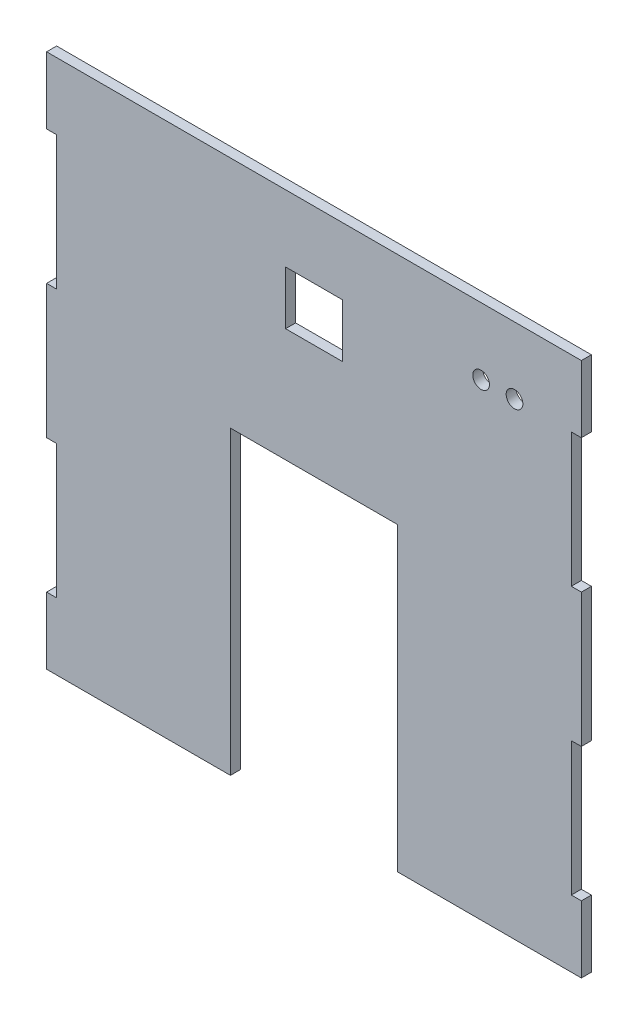
ISO-10303-21;
HEADER;
FILE_DESCRIPTION(('STEP AP214'),'2;1');
FILE_NAME('part.step','',(''),(''),'','','');
FILE_SCHEMA(('AUTOMOTIVE_DESIGN { 1 0 10303 214 1 1 1 1 }'));
ENDSEC;
DATA;
#1=APPLICATION_CONTEXT('core data for automotive mechanical design processes');
#2=APPLICATION_PROTOCOL_DEFINITION('international standard','automotive_design',2000,#1);
#3=PRODUCT_CONTEXT('',#1,'mechanical');
#4=PRODUCT('Part','Part','',(#3));
#5=PRODUCT_RELATED_PRODUCT_CATEGORY('part','',(#4));
#6=PRODUCT_DEFINITION_FORMATION('','',#4);
#7=PRODUCT_DEFINITION_CONTEXT('part definition',#1,'design');
#8=PRODUCT_DEFINITION('design','',#6,#7);
#9=PRODUCT_DEFINITION_SHAPE('','',#8);
#10=(LENGTH_UNIT() NAMED_UNIT(*) SI_UNIT(.MILLI.,.METRE.));
#11=(NAMED_UNIT(*) PLANE_ANGLE_UNIT() SI_UNIT($,.RADIAN.));
#12=(NAMED_UNIT(*) SI_UNIT($,.STERADIAN.) SOLID_ANGLE_UNIT());
#13=UNCERTAINTY_MEASURE_WITH_UNIT(LENGTH_MEASURE(1.E-05),#10,'distance_accuracy_value','');
#14=(GEOMETRIC_REPRESENTATION_CONTEXT(3) GLOBAL_UNCERTAINTY_ASSIGNED_CONTEXT((#13)) GLOBAL_UNIT_ASSIGNED_CONTEXT((#10,
#11,#12)) REPRESENTATION_CONTEXT('',''));
#15=CARTESIAN_POINT('',(0.,0.,0.));
#16=DIRECTION('',(0.,0.,1.));
#17=DIRECTION('',(1.,0.,0.));
#18=AXIS2_PLACEMENT_3D('',#15,#16,#17);
#19=CARTESIAN_POINT('',(79.9999999999999,0.,3.));
#20=DIRECTION('',(1.,0.,0.));
#21=DIRECTION('',(0.,1.,0.));
#22=AXIS2_PLACEMENT_3D('',#19,#20,#21);
#23=PLANE('',#22);
#24=DIRECTION('',(0.,0.,1.));
#25=VECTOR('',#24,1.);
#26=CARTESIAN_POINT('',(79.9999999999999,60.,0.));
#27=LINE('',#26,#25);
#28=CARTESIAN_POINT('',(79.9999999999999,60.,0.));
#29=VERTEX_POINT('',#28);
#30=CARTESIAN_POINT('',(79.9999999999999,60.,3.));
#31=VERTEX_POINT('',#30);
#32=EDGE_CURVE('E317',#29,#31,#27,.T.);
#33=ORIENTED_EDGE('',*,*,#32,.F.);
#34=DIRECTION('',(0.,-1.,0.));
#35=VECTOR('',#34,1.);
#36=CARTESIAN_POINT('',(79.9999999999999,0.,0.));
#37=LINE('',#36,#35);
#38=CARTESIAN_POINT('',(79.9999999999999,80.,0.));
#39=VERTEX_POINT('',#38);
#40=EDGE_CURVE('E449',#39,#29,#37,.T.);
#41=ORIENTED_EDGE('',*,*,#40,.F.);
#42=DIRECTION('',(0.,0.,-1.));
#43=VECTOR('',#42,1.);
#44=CARTESIAN_POINT('',(79.9999999999999,80.,3.));
#45=LINE('',#44,#43);
#46=CARTESIAN_POINT('',(79.9999999999999,80.,3.));
#47=VERTEX_POINT('',#46);
#48=EDGE_CURVE('E512',#47,#39,#45,.T.);
#49=ORIENTED_EDGE('',*,*,#48,.F.);
#50=DIRECTION('',(0.,-1.,0.));
#51=VECTOR('',#50,1.);
#52=CARTESIAN_POINT('',(79.9999999999999,0.,3.));
#53=LINE('',#52,#51);
#54=EDGE_CURVE('E394',#47,#31,#53,.T.);
#55=ORIENTED_EDGE('',*,*,#54,.T.);
#56=EDGE_LOOP('',(#33,#41,#49,#55));
#57=FACE_BOUND('',#56,.T.);
#58=ADVANCED_FACE('F41',(#57),#23,.T.);
#59=DIRECTION('',(0.,0.,1.));
#60=VECTOR('',#59,1.);
#61=CARTESIAN_POINT('',(79.9999999999999,20.,0.));
#62=LINE('',#61,#60);
#63=CARTESIAN_POINT('',(79.9999999999999,20.,0.));
#64=VERTEX_POINT('',#63);
#65=CARTESIAN_POINT('',(79.9999999999999,20.,3.));
#66=VERTEX_POINT('',#65);
#67=EDGE_CURVE('E67',#64,#66,#62,.T.);
#68=ORIENTED_EDGE('',*,*,#67,.T.);
#69=CARTESIAN_POINT('',(79.9999999999999,-20.,3.));
#70=VERTEX_POINT('',#69);
#71=EDGE_CURVE('E399',#66,#70,#53,.T.);
#72=ORIENTED_EDGE('',*,*,#71,.T.);
#73=DIRECTION('',(0.,0.,1.));
#74=VECTOR('',#73,1.);
#75=CARTESIAN_POINT('',(79.9999999999999,-20.,0.));
#76=LINE('',#75,#74);
#77=CARTESIAN_POINT('',(79.9999999999999,-20.,0.));
#78=VERTEX_POINT('',#77);
#79=EDGE_CURVE('E284',#78,#70,#76,.T.);
#80=ORIENTED_EDGE('',*,*,#79,.F.);
#81=EDGE_CURVE('E454',#64,#78,#37,.T.);
#82=ORIENTED_EDGE('',*,*,#81,.F.);
#83=EDGE_LOOP('',(#68,#72,#80,#82));
#84=FACE_BOUND('',#83,.T.);
#85=ADVANCED_FACE('F557',(#84),#23,.T.);
#86=CARTESIAN_POINT('',(-80.,0.,3.));
#87=DIRECTION('',(1.,0.,0.));
#88=DIRECTION('',(0.,1.,0.));
#89=AXIS2_PLACEMENT_3D('',#86,#87,#88);
#90=PLANE('',#89);
#91=DIRECTION('',(0.,-1.,0.));
#92=VECTOR('',#91,1.);
#93=CARTESIAN_POINT('',(-80.,0.,3.));
#94=LINE('',#93,#92);
#95=CARTESIAN_POINT('',(-80.,-60.,3.));
#96=VERTEX_POINT('',#95);
#97=CARTESIAN_POINT('',(-80.,-80.,3.));
#98=VERTEX_POINT('',#97);
#99=EDGE_CURVE('E403',#96,#98,#94,.T.);
#100=ORIENTED_EDGE('',*,*,#99,.F.);
#101=DIRECTION('',(0.,0.,1.));
#102=VECTOR('',#101,1.);
#103=CARTESIAN_POINT('',(-80.,-60.,0.));
#104=LINE('',#103,#102);
#105=CARTESIAN_POINT('',(-80.,-60.,0.));
#106=VERTEX_POINT('',#105);
#107=EDGE_CURVE('E242',#106,#96,#104,.T.);
#108=ORIENTED_EDGE('',*,*,#107,.F.);
#109=DIRECTION('',(0.,-1.,0.));
#110=VECTOR('',#109,1.);
#111=CARTESIAN_POINT('',(-80.,0.,0.));
#112=LINE('',#111,#110);
#113=CARTESIAN_POINT('',(-80.,-80.,0.));
#114=VERTEX_POINT('',#113);
#115=EDGE_CURVE('E458',#106,#114,#112,.T.);
#116=ORIENTED_EDGE('',*,*,#115,.T.);
#117=DIRECTION('',(0.,0.,-1.));
#118=VECTOR('',#117,1.);
#119=CARTESIAN_POINT('',(-80.,-80.,3.));
#120=LINE('',#119,#118);
#121=EDGE_CURVE('E505',#98,#114,#120,.T.);
#122=ORIENTED_EDGE('',*,*,#121,.F.);
#123=EDGE_LOOP('',(#100,#108,#116,#122));
#124=FACE_BOUND('',#123,.T.);
#125=ADVANCED_FACE('F577',(#124),#90,.F.);
#126=CARTESIAN_POINT('',(-80.,20.,0.));
#127=VERTEX_POINT('',#126);
#128=CARTESIAN_POINT('',(-80.,-20.,0.));
#129=VERTEX_POINT('',#128);
#130=EDGE_CURVE('E463',#127,#129,#112,.T.);
#131=ORIENTED_EDGE('',*,*,#130,.T.);
#132=DIRECTION('',(0.,0.,1.));
#133=VECTOR('',#132,1.);
#134=CARTESIAN_POINT('',(-80.,-20.,0.));
#135=LINE('',#134,#133);
#136=CARTESIAN_POINT('',(-80.,-20.,3.));
#137=VERTEX_POINT('',#136);
#138=EDGE_CURVE('E586',#129,#137,#135,.T.);
#139=ORIENTED_EDGE('',*,*,#138,.T.);
#140=CARTESIAN_POINT('',(-80.,20.,3.));
#141=VERTEX_POINT('',#140);
#142=EDGE_CURVE('E408',#141,#137,#94,.T.);
#143=ORIENTED_EDGE('',*,*,#142,.F.);
#144=DIRECTION('',(0.,0.,1.));
#145=VECTOR('',#144,1.);
#146=CARTESIAN_POINT('',(-80.,20.,0.));
#147=LINE('',#146,#145);
#148=EDGE_CURVE('E366',#127,#141,#147,.T.);
#149=ORIENTED_EDGE('',*,*,#148,.F.);
#150=EDGE_LOOP('',(#131,#139,#143,#149));
#151=FACE_BOUND('',#150,.T.);
#152=ADVANCED_FACE('F584',(#151),#90,.F.);
#153=CARTESIAN_POINT('',(0.,60.,3.));
#154=DIRECTION('',(0.,1.,0.));
#155=DIRECTION('',(0.,0.,1.));
#156=AXIS2_PLACEMENT_3D('',#153,#154,#155);
#157=PLANE('',#156);
#158=DIRECTION('',(1.,0.,0.));
#159=VECTOR('',#158,1.);
#160=CARTESIAN_POINT('',(0.,60.,0.));
#161=LINE('',#160,#159);
#162=CARTESIAN_POINT('',(-8.5,60.,0.));
#163=VERTEX_POINT('',#162);
#164=CARTESIAN_POINT('',(8.5,60.,0.));
#165=VERTEX_POINT('',#164);
#166=EDGE_CURVE('E472',#163,#165,#161,.T.);
#167=ORIENTED_EDGE('',*,*,#166,.T.);
#168=DIRECTION('',(0.,0.,-1.));
#169=VECTOR('',#168,1.);
#170=CARTESIAN_POINT('',(8.5,60.,3.));
#171=LINE('',#170,#169);
#172=CARTESIAN_POINT('',(8.5,60.,3.));
#173=VERTEX_POINT('',#172);
#174=EDGE_CURVE('E12',#173,#165,#171,.T.);
#175=ORIENTED_EDGE('',*,*,#174,.F.);
#176=DIRECTION('',(1.,0.,0.));
#177=VECTOR('',#176,1.);
#178=CARTESIAN_POINT('',(0.,60.,3.));
#179=LINE('',#178,#177);
#180=CARTESIAN_POINT('',(-8.5,60.,3.));
#181=VERTEX_POINT('',#180);
#182=EDGE_CURVE('E416',#181,#173,#179,.T.);
#183=ORIENTED_EDGE('',*,*,#182,.F.);
#184=DIRECTION('',(0.,0.,-1.));
#185=VECTOR('',#184,1.);
#186=CARTESIAN_POINT('',(-8.5,60.,3.));
#187=LINE('',#186,#185);
#188=EDGE_CURVE('E487',#181,#163,#187,.T.);
#189=ORIENTED_EDGE('',*,*,#188,.T.);
#190=EDGE_LOOP('',(#167,#175,#183,#189));
#191=FACE_BOUND('',#190,.T.);
#192=ADVANCED_FACE('F651',(#191),#157,.F.);
#193=CARTESIAN_POINT('',(8.50000000000001,0.,3.));
#194=DIRECTION('',(1.,0.,0.));
#195=DIRECTION('',(0.,1.,0.));
#196=AXIS2_PLACEMENT_3D('',#193,#194,#195);
#197=PLANE('',#196);
#198=DIRECTION('',(0.,-1.,0.));
#199=VECTOR('',#198,1.);
#200=CARTESIAN_POINT('',(8.50000000000001,0.,0.));
#201=LINE('',#200,#199);
#202=CARTESIAN_POINT('',(8.5,44.,0.));
#203=VERTEX_POINT('',#202);
#204=EDGE_CURVE('E476',#165,#203,#201,.T.);
#205=ORIENTED_EDGE('',*,*,#204,.T.);
#206=DIRECTION('',(0.,0.,-1.));
#207=VECTOR('',#206,1.);
#208=CARTESIAN_POINT('',(8.5,44.,3.));
#209=LINE('',#208,#207);
#210=CARTESIAN_POINT('',(8.5,44.,3.));
#211=VERTEX_POINT('',#210);
#212=EDGE_CURVE('E51',#211,#203,#209,.T.);
#213=ORIENTED_EDGE('',*,*,#212,.F.);
#214=DIRECTION('',(0.,-1.,0.));
#215=VECTOR('',#214,1.);
#216=CARTESIAN_POINT('',(8.50000000000001,0.,3.));
#217=LINE('',#216,#215);
#218=EDGE_CURVE('E420',#173,#211,#217,.T.);
#219=ORIENTED_EDGE('',*,*,#218,.F.);
#220=ORIENTED_EDGE('',*,*,#174,.T.);
#221=EDGE_LOOP('',(#205,#213,#219,#220));
#222=FACE_BOUND('',#221,.T.);
#223=ADVANCED_FACE('F655',(#222),#197,.F.);
#224=CARTESIAN_POINT('',(0.,44.,3.));
#225=DIRECTION('',(0.,1.,0.));
#226=DIRECTION('',(0.,0.,1.));
#227=AXIS2_PLACEMENT_3D('',#224,#225,#226);
#228=PLANE('',#227);
#229=DIRECTION('',(1.,0.,0.));
#230=VECTOR('',#229,1.);
#231=CARTESIAN_POINT('',(0.,44.,0.));
#232=LINE('',#231,#230);
#233=CARTESIAN_POINT('',(-8.49999999999999,44.,0.));
#234=VERTEX_POINT('',#233);
#235=EDGE_CURVE('E480',#234,#203,#232,.T.);
#236=ORIENTED_EDGE('',*,*,#235,.F.);
#237=DIRECTION('',(0.,0.,-1.));
#238=VECTOR('',#237,1.);
#239=CARTESIAN_POINT('',(-8.49999999999999,44.,3.));
#240=LINE('',#239,#238);
#241=CARTESIAN_POINT('',(-8.49999999999999,44.,3.));
#242=VERTEX_POINT('',#241);
#243=EDGE_CURVE('E490',#242,#234,#240,.T.);
#244=ORIENTED_EDGE('',*,*,#243,.F.);
#245=DIRECTION('',(1.,0.,0.));
#246=VECTOR('',#245,1.);
#247=CARTESIAN_POINT('',(0.,44.,3.));
#248=LINE('',#247,#246);
#249=EDGE_CURVE('E423',#242,#211,#248,.T.);
#250=ORIENTED_EDGE('',*,*,#249,.T.);
#251=ORIENTED_EDGE('',*,*,#212,.T.);
#252=EDGE_LOOP('',(#236,#244,#250,#251));
#253=FACE_BOUND('',#252,.T.);
#254=ADVANCED_FACE('F639',(#253),#228,.T.);
#255=CARTESIAN_POINT('',(25.,0.,3.));
#256=DIRECTION('',(-1.,0.,0.));
#257=DIRECTION('',(0.,-1.,0.));
#258=AXIS2_PLACEMENT_3D('',#255,#256,#257);
#259=PLANE('',#258);
#260=DIRECTION('',(0.,1.,0.));
#261=VECTOR('',#260,1.);
#262=CARTESIAN_POINT('',(25.,0.,0.));
#263=LINE('',#262,#261);
#264=CARTESIAN_POINT('',(25.,-80.,0.));
#265=VERTEX_POINT('',#264);
#266=CARTESIAN_POINT('',(25.,10.,0.));
#267=VERTEX_POINT('',#266);
#268=EDGE_CURVE('E439',#265,#267,#263,.T.);
#269=ORIENTED_EDGE('',*,*,#268,.F.);
#270=DIRECTION('',(0.,0.,-1.));
#271=VECTOR('',#270,1.);
#272=CARTESIAN_POINT('',(25.,-80.,3.));
#273=LINE('',#272,#271);
#274=CARTESIAN_POINT('',(25.,-80.,3.));
#275=VERTEX_POINT('',#274);
#276=EDGE_CURVE('E45',#275,#265,#273,.T.);
#277=ORIENTED_EDGE('',*,*,#276,.F.);
#278=DIRECTION('',(0.,1.,0.));
#279=VECTOR('',#278,1.);
#280=CARTESIAN_POINT('',(25.,0.,3.));
#281=LINE('',#280,#279);
#282=CARTESIAN_POINT('',(25.,10.,3.));
#283=VERTEX_POINT('',#282);
#284=EDGE_CURVE('E384',#275,#283,#281,.T.);
#285=ORIENTED_EDGE('',*,*,#284,.T.);
#286=DIRECTION('',(0.,0.,-1.));
#287=VECTOR('',#286,1.);
#288=CARTESIAN_POINT('',(25.,10.,3.));
#289=LINE('',#288,#287);
#290=EDGE_CURVE('E431',#283,#267,#289,.T.);
#291=ORIENTED_EDGE('',*,*,#290,.T.);
#292=EDGE_LOOP('',(#269,#277,#285,#291));
#293=FACE_BOUND('',#292,.T.);
#294=ADVANCED_FACE('F531',(#293),#259,.T.);
#295=CARTESIAN_POINT('',(0.,-80.,3.));
#296=DIRECTION('',(0.,1.,0.));
#297=DIRECTION('',(0.,0.,1.));
#298=AXIS2_PLACEMENT_3D('',#295,#296,#297);
#299=PLANE('',#298);
#300=DIRECTION('',(1.,0.,0.));
#301=VECTOR('',#300,1.);
#302=CARTESIAN_POINT('',(0.,-80.,0.));
#303=LINE('',#302,#301);
#304=CARTESIAN_POINT('',(80.,-80.,0.));
#305=VERTEX_POINT('',#304);
#306=EDGE_CURVE('E443',#265,#305,#303,.T.);
#307=ORIENTED_EDGE('',*,*,#306,.T.);
#308=DIRECTION('',(0.,0.,-1.));
#309=VECTOR('',#308,1.);
#310=CARTESIAN_POINT('',(80.,-80.,3.));
#311=LINE('',#310,#309);
#312=CARTESIAN_POINT('',(80.,-80.,3.));
#313=VERTEX_POINT('',#312);
#314=EDGE_CURVE('E514',#313,#305,#311,.T.);
#315=ORIENTED_EDGE('',*,*,#314,.F.);
#316=DIRECTION('',(1.,0.,0.));
#317=VECTOR('',#316,1.);
#318=CARTESIAN_POINT('',(0.,-80.,3.));
#319=LINE('',#318,#317);
#320=EDGE_CURVE('E388',#275,#313,#319,.T.);
#321=ORIENTED_EDGE('',*,*,#320,.F.);
#322=ORIENTED_EDGE('',*,*,#276,.T.);
#323=EDGE_LOOP('',(#307,#315,#321,#322));
#324=FACE_BOUND('',#323,.T.);
#325=ADVANCED_FACE('F524',(#324),#299,.F.);
#326=DIRECTION('',(0.,0.,1.));
#327=VECTOR('',#326,1.);
#328=CARTESIAN_POINT('',(80.,-60.,0.));
#329=LINE('',#328,#327);
#330=CARTESIAN_POINT('',(80.,-60.,0.));
#331=VERTEX_POINT('',#330);
#332=CARTESIAN_POINT('',(80.,-60.,3.));
#333=VERTEX_POINT('',#332);
#334=EDGE_CURVE('E59',#331,#333,#329,.T.);
#335=ORIENTED_EDGE('',*,*,#334,.T.);
#336=EDGE_CURVE('E392',#333,#313,#53,.T.);
#337=ORIENTED_EDGE('',*,*,#336,.T.);
#338=ORIENTED_EDGE('',*,*,#314,.T.);
#339=EDGE_CURVE('E447',#331,#305,#37,.T.);
#340=ORIENTED_EDGE('',*,*,#339,.F.);
#341=EDGE_LOOP('',(#335,#337,#338,#340));
#342=FACE_BOUND('',#341,.T.);
#343=ADVANCED_FACE('F570',(#342),#23,.T.);
#344=CARTESIAN_POINT('',(0.,80.,3.));
#345=DIRECTION('',(0.,1.,0.));
#346=DIRECTION('',(0.,0.,1.));
#347=AXIS2_PLACEMENT_3D('',#344,#345,#346);
#348=PLANE('',#347);
#349=DIRECTION('',(1.,0.,0.));
#350=VECTOR('',#349,1.);
#351=CARTESIAN_POINT('',(0.,80.,0.));
#352=LINE('',#351,#350);
#353=CARTESIAN_POINT('',(-80.0000000000001,80.,0.));
#354=VERTEX_POINT('',#353);
#355=EDGE_CURVE('E453',#354,#39,#352,.T.);
#356=ORIENTED_EDGE('',*,*,#355,.F.);
#357=DIRECTION('',(0.,0.,-1.));
#358=VECTOR('',#357,1.);
#359=CARTESIAN_POINT('',(-80.0000000000001,80.,3.));
#360=LINE('',#359,#358);
#361=CARTESIAN_POINT('',(-80.0000000000001,80.,3.));
#362=VERTEX_POINT('',#361);
#363=EDGE_CURVE('E509',#362,#354,#360,.T.);
#364=ORIENTED_EDGE('',*,*,#363,.F.);
#365=DIRECTION('',(1.,0.,0.));
#366=VECTOR('',#365,1.);
#367=CARTESIAN_POINT('',(0.,80.,3.));
#368=LINE('',#367,#366);
#369=EDGE_CURVE('E398',#362,#47,#368,.T.);
#370=ORIENTED_EDGE('',*,*,#369,.T.);
#371=ORIENTED_EDGE('',*,*,#48,.T.);
#372=EDGE_LOOP('',(#356,#364,#370,#371));
#373=FACE_BOUND('',#372,.T.);
#374=ADVANCED_FACE('F604',(#373),#348,.T.);
#375=CARTESIAN_POINT('',(-80.,60.,0.));
#376=VERTEX_POINT('',#375);
#377=EDGE_CURVE('E459',#354,#376,#112,.T.);
#378=ORIENTED_EDGE('',*,*,#377,.T.);
#379=DIRECTION('',(0.,0.,1.));
#380=VECTOR('',#379,1.);
#381=CARTESIAN_POINT('',(-80.,60.,0.));
#382=LINE('',#381,#380);
#383=CARTESIAN_POINT('',(-80.,60.,3.));
#384=VERTEX_POINT('',#383);
#385=EDGE_CURVE('E369',#376,#384,#382,.T.);
#386=ORIENTED_EDGE('',*,*,#385,.T.);
#387=EDGE_CURVE('E404',#362,#384,#94,.T.);
#388=ORIENTED_EDGE('',*,*,#387,.F.);
#389=ORIENTED_EDGE('',*,*,#363,.T.);
#390=EDGE_LOOP('',(#378,#386,#388,#389));
#391=FACE_BOUND('',#390,.T.);
#392=ADVANCED_FACE('F600',(#391),#90,.F.);
#393=CARTESIAN_POINT('',(-25.,-80.,0.));
#394=VERTEX_POINT('',#393);
#395=EDGE_CURVE('E448',#114,#394,#303,.T.);
#396=ORIENTED_EDGE('',*,*,#395,.T.);
#397=DIRECTION('',(0.,0.,-1.));
#398=VECTOR('',#397,1.);
#399=CARTESIAN_POINT('',(-25.,-80.,3.));
#400=LINE('',#399,#398);
#401=CARTESIAN_POINT('',(-25.,-80.,3.));
#402=VERTEX_POINT('',#401);
#403=EDGE_CURVE('E501',#402,#394,#400,.T.);
#404=ORIENTED_EDGE('',*,*,#403,.F.);
#405=EDGE_CURVE('E393',#98,#402,#319,.T.);
#406=ORIENTED_EDGE('',*,*,#405,.F.);
#407=ORIENTED_EDGE('',*,*,#121,.T.);
#408=EDGE_LOOP('',(#396,#404,#406,#407));
#409=FACE_BOUND('',#408,.T.);
#410=ADVANCED_FACE('F545',(#409),#299,.F.);
#411=CARTESIAN_POINT('',(-25.,0.,3.));
#412=DIRECTION('',(-1.,0.,0.));
#413=DIRECTION('',(0.,-1.,0.));
#414=AXIS2_PLACEMENT_3D('',#411,#412,#413);
#415=PLANE('',#414);
#416=DIRECTION('',(0.,1.,0.));
#417=VECTOR('',#416,1.);
#418=CARTESIAN_POINT('',(-25.,0.,0.));
#419=LINE('',#418,#417);
#420=CARTESIAN_POINT('',(-25.,9.99999999999999,0.));
#421=VERTEX_POINT('',#420);
#422=EDGE_CURVE('E464',#394,#421,#419,.T.);
#423=ORIENTED_EDGE('',*,*,#422,.T.);
#424=DIRECTION('',(0.,0.,-1.));
#425=VECTOR('',#424,1.);
#426=CARTESIAN_POINT('',(-25.,9.99999999999999,3.));
#427=LINE('',#426,#425);
#428=CARTESIAN_POINT('',(-25.,9.99999999999999,3.));
#429=VERTEX_POINT('',#428);
#430=EDGE_CURVE('E497',#429,#421,#427,.T.);
#431=ORIENTED_EDGE('',*,*,#430,.F.);
#432=DIRECTION('',(0.,1.,0.));
#433=VECTOR('',#432,1.);
#434=CARTESIAN_POINT('',(-25.,0.,3.));
#435=LINE('',#434,#433);
#436=EDGE_CURVE('E409',#402,#429,#435,.T.);
#437=ORIENTED_EDGE('',*,*,#436,.F.);
#438=ORIENTED_EDGE('',*,*,#403,.T.);
#439=EDGE_LOOP('',(#423,#431,#437,#438));
#440=FACE_BOUND('',#439,.T.);
#441=ADVANCED_FACE('F541',(#440),#415,.F.);
#442=CARTESIAN_POINT('',(0.,10.,3.));
#443=DIRECTION('',(0.,1.,0.));
#444=DIRECTION('',(-1.,0.,0.));
#445=AXIS2_PLACEMENT_3D('',#442,#443,#444);
#446=PLANE('',#445);
#447=DIRECTION('',(1.,0.,0.));
#448=VECTOR('',#447,1.);
#449=CARTESIAN_POINT('',(0.,10.,0.));
#450=LINE('',#449,#448);
#451=EDGE_CURVE('E468',#421,#267,#450,.T.);
#452=ORIENTED_EDGE('',*,*,#451,.T.);
#453=ORIENTED_EDGE('',*,*,#290,.F.);
#454=DIRECTION('',(1.,0.,0.));
#455=VECTOR('',#454,1.);
#456=CARTESIAN_POINT('',(0.,10.,3.));
#457=LINE('',#456,#455);
#458=EDGE_CURVE('E413',#429,#283,#457,.T.);
#459=ORIENTED_EDGE('',*,*,#458,.F.);
#460=ORIENTED_EDGE('',*,*,#430,.T.);
#461=EDGE_LOOP('',(#452,#453,#459,#460));
#462=FACE_BOUND('',#461,.T.);
#463=ADVANCED_FACE('F534',(#462),#446,.F.);
#464=CARTESIAN_POINT('',(50.,60.,3.));
#465=DIRECTION('',(0.,0.,-1.));
#466=DIRECTION('',(-1.,0.,0.));
#467=AXIS2_PLACEMENT_3D('',#464,#465,#466);
#468=CYLINDRICAL_SURFACE('',#467,2.5);
#469=CARTESIAN_POINT('',(50.,60.,3.));
#470=DIRECTION('',(0.,0.,1.));
#471=DIRECTION('',(1.,0.,0.));
#472=AXIS2_PLACEMENT_3D('',#469,#470,#471);
#473=CIRCLE('',#472,2.5);
#474=CARTESIAN_POINT('',(52.5,60.,3.));
#475=VERTEX_POINT('',#474);
#476=EDGE_CURVE('E379',#475,#475,#473,.T.);
#477=ORIENTED_EDGE('',*,*,#476,.T.);
#478=EDGE_LOOP('',(#477));
#479=FACE_BOUND('',#478,.T.);
#480=CARTESIAN_POINT('',(50.,60.,0.));
#481=DIRECTION('',(0.,0.,1.));
#482=DIRECTION('',(1.,0.,0.));
#483=AXIS2_PLACEMENT_3D('',#480,#481,#482);
#484=CIRCLE('',#483,2.5);
#485=CARTESIAN_POINT('',(52.5,60.,0.));
#486=VERTEX_POINT('',#485);
#487=EDGE_CURVE('E435',#486,#486,#484,.T.);
#488=ORIENTED_EDGE('',*,*,#487,.F.);
#489=EDGE_LOOP('',(#488));
#490=FACE_BOUND('',#489,.T.);
#491=ADVANCED_FACE('F666',(#479,#490),#468,.F.);
#492=CARTESIAN_POINT('',(60.,60.,3.));
#493=DIRECTION('',(0.,0.,-1.));
#494=DIRECTION('',(-1.,0.,0.));
#495=AXIS2_PLACEMENT_3D('',#492,#493,#494);
#496=CYLINDRICAL_SURFACE('',#495,2.5);
#497=CARTESIAN_POINT('',(60.,60.,3.));
#498=DIRECTION('',(0.,0.,1.));
#499=DIRECTION('',(1.,0.,0.));
#500=AXIS2_PLACEMENT_3D('',#497,#498,#499);
#501=CIRCLE('',#500,2.5);
#502=CARTESIAN_POINT('',(62.5,60.,3.));
#503=VERTEX_POINT('',#502);
#504=EDGE_CURVE('E375',#503,#503,#501,.T.);
#505=ORIENTED_EDGE('',*,*,#504,.T.);
#506=EDGE_LOOP('',(#505));
#507=FACE_BOUND('',#506,.T.);
#508=CARTESIAN_POINT('',(60.,60.,0.));
#509=DIRECTION('',(0.,0.,1.));
#510=DIRECTION('',(1.,0.,0.));
#511=AXIS2_PLACEMENT_3D('',#508,#509,#510);
#512=CIRCLE('',#511,2.5);
#513=CARTESIAN_POINT('',(62.5,60.,0.));
#514=VERTEX_POINT('',#513);
#515=EDGE_CURVE('E365',#514,#514,#512,.T.);
#516=ORIENTED_EDGE('',*,*,#515,.F.);
#517=EDGE_LOOP('',(#516));
#518=FACE_BOUND('',#517,.T.);
#519=ADVANCED_FACE('F43',(#507,#518),#496,.F.);
#520=CARTESIAN_POINT('',(-8.49999999999998,0.,3.));
#521=DIRECTION('',(1.,0.,0.));
#522=DIRECTION('',(0.,1.,0.));
#523=AXIS2_PLACEMENT_3D('',#520,#521,#522);
#524=PLANE('',#523);
#525=DIRECTION('',(0.,-1.,0.));
#526=VECTOR('',#525,1.);
#527=CARTESIAN_POINT('',(-8.49999999999998,0.,0.));
#528=LINE('',#527,#526);
#529=EDGE_CURVE('E380',#163,#234,#528,.T.);
#530=ORIENTED_EDGE('',*,*,#529,.F.);
#531=ORIENTED_EDGE('',*,*,#188,.F.);
#532=DIRECTION('',(0.,-1.,0.));
#533=VECTOR('',#532,1.);
#534=CARTESIAN_POINT('',(-8.49999999999998,0.,3.));
#535=LINE('',#534,#533);
#536=EDGE_CURVE('E427',#181,#242,#535,.T.);
#537=ORIENTED_EDGE('',*,*,#536,.T.);
#538=ORIENTED_EDGE('',*,*,#243,.T.);
#539=EDGE_LOOP('',(#530,#531,#537,#538));
#540=FACE_BOUND('',#539,.T.);
#541=ADVANCED_FACE('F674',(#540),#524,.T.);
#542=CARTESIAN_POINT('',(0.,0.,3.));
#543=DIRECTION('',(0.,0.,1.));
#544=DIRECTION('',(1.,0.,0.));
#545=AXIS2_PLACEMENT_3D('',#542,#543,#544);
#546=PLANE('',#545);
#547=DIRECTION('',(-1.,0.,0.));
#548=VECTOR('',#547,1.);
#549=CARTESIAN_POINT('',(0.,60.,3.));
#550=LINE('',#549,#548);
#551=CARTESIAN_POINT('',(77.,60.,3.));
#552=VERTEX_POINT('',#551);
#553=EDGE_CURVE('E323',#31,#552,#550,.T.);
#554=ORIENTED_EDGE('',*,*,#553,.F.);
#555=ORIENTED_EDGE('',*,*,#54,.F.);
#556=ORIENTED_EDGE('',*,*,#369,.F.);
#557=ORIENTED_EDGE('',*,*,#387,.T.);
#558=DIRECTION('',(-1.,0.,0.));
#559=VECTOR('',#558,1.);
#560=CARTESIAN_POINT('',(0.,60.,3.));
#561=LINE('',#560,#559);
#562=CARTESIAN_POINT('',(-77.0000000000001,60.,3.));
#563=VERTEX_POINT('',#562);
#564=EDGE_CURVE('E264',#563,#384,#561,.T.);
#565=ORIENTED_EDGE('',*,*,#564,.F.);
#566=DIRECTION('',(0.,1.,0.));
#567=VECTOR('',#566,1.);
#568=CARTESIAN_POINT('',(-77.,0.,3.));
#569=LINE('',#568,#567);
#570=CARTESIAN_POINT('',(-77.,20.,3.));
#571=VERTEX_POINT('',#570);
#572=EDGE_CURVE('E259',#571,#563,#569,.T.);
#573=ORIENTED_EDGE('',*,*,#572,.F.);
#574=DIRECTION('',(1.,0.,0.));
#575=VECTOR('',#574,1.);
#576=CARTESIAN_POINT('',(0.,20.,3.));
#577=LINE('',#576,#575);
#578=EDGE_CURVE('E348',#141,#571,#577,.T.);
#579=ORIENTED_EDGE('',*,*,#578,.F.);
#580=ORIENTED_EDGE('',*,*,#142,.T.);
#581=DIRECTION('',(-1.,0.,0.));
#582=VECTOR('',#581,1.);
#583=CARTESIAN_POINT('',(0.,-20.,3.));
#584=LINE('',#583,#582);
#585=CARTESIAN_POINT('',(-77.,-20.,3.));
#586=VERTEX_POINT('',#585);
#587=EDGE_CURVE('E252',#586,#137,#584,.T.);
#588=ORIENTED_EDGE('',*,*,#587,.F.);
#589=DIRECTION('',(0.,1.,0.));
#590=VECTOR('',#589,1.);
#591=CARTESIAN_POINT('',(-77.,0.,3.));
#592=LINE('',#591,#590);
#593=CARTESIAN_POINT('',(-77.,-60.,3.));
#594=VERTEX_POINT('',#593);
#595=EDGE_CURVE('E235',#594,#586,#592,.T.);
#596=ORIENTED_EDGE('',*,*,#595,.F.);
#597=DIRECTION('',(1.,0.,0.));
#598=VECTOR('',#597,1.);
#599=CARTESIAN_POINT('',(-5.55111512312582E-13,-60.0000000000008,3.));
#600=LINE('',#599,#598);
#601=EDGE_CURVE('E246',#96,#594,#600,.T.);
#602=ORIENTED_EDGE('',*,*,#601,.F.);
#603=ORIENTED_EDGE('',*,*,#99,.T.);
#604=ORIENTED_EDGE('',*,*,#405,.T.);
#605=ORIENTED_EDGE('',*,*,#436,.T.);
#606=ORIENTED_EDGE('',*,*,#458,.T.);
#607=ORIENTED_EDGE('',*,*,#284,.F.);
#608=ORIENTED_EDGE('',*,*,#320,.T.);
#609=ORIENTED_EDGE('',*,*,#336,.F.);
#610=DIRECTION('',(1.,0.,0.));
#611=VECTOR('',#610,1.);
#612=CARTESIAN_POINT('',(0.,-60.,3.));
#613=LINE('',#612,#611);
#614=CARTESIAN_POINT('',(77.,-60.,3.));
#615=VERTEX_POINT('',#614);
#616=EDGE_CURVE('E295',#615,#333,#613,.T.);
#617=ORIENTED_EDGE('',*,*,#616,.F.);
#618=DIRECTION('',(0.,-1.,0.));
#619=VECTOR('',#618,1.);
#620=CARTESIAN_POINT('',(77.,0.,3.));
#621=LINE('',#620,#619);
#622=CARTESIAN_POINT('',(77.,-20.,3.));
#623=VERTEX_POINT('',#622);
#624=EDGE_CURVE('E243',#623,#615,#621,.T.);
#625=ORIENTED_EDGE('',*,*,#624,.F.);
#626=DIRECTION('',(-1.,0.,0.));
#627=VECTOR('',#626,1.);
#628=CARTESIAN_POINT('',(0.,-20.,3.));
#629=LINE('',#628,#627);
#630=EDGE_CURVE('E291',#70,#623,#629,.T.);
#631=ORIENTED_EDGE('',*,*,#630,.F.);
#632=ORIENTED_EDGE('',*,*,#71,.F.);
#633=DIRECTION('',(1.,0.,0.));
#634=VECTOR('',#633,1.);
#635=CARTESIAN_POINT('',(0.,20.,3.));
#636=LINE('',#635,#634);
#637=CARTESIAN_POINT('',(77.,20.,3.));
#638=VERTEX_POINT('',#637);
#639=EDGE_CURVE('E327',#638,#66,#636,.T.);
#640=ORIENTED_EDGE('',*,*,#639,.F.);
#641=DIRECTION('',(0.,-1.,0.));
#642=VECTOR('',#641,1.);
#643=CARTESIAN_POINT('',(77.,0.,3.));
#644=LINE('',#643,#642);
#645=EDGE_CURVE('E290',#552,#638,#644,.T.);
#646=ORIENTED_EDGE('',*,*,#645,.F.);
#647=EDGE_LOOP('',(#554,#555,#556,#557,#565,#573,#579,#580,#588,#596,#602,#603,#604,#605,#606,
#607,#608,#609,#617,#625,#631,#632,#640,#646));
#648=FACE_BOUND('',#647,.T.);
#649=ORIENTED_EDGE('',*,*,#504,.F.);
#650=EDGE_LOOP('',(#649));
#651=FACE_BOUND('',#650,.T.);
#652=ORIENTED_EDGE('',*,*,#476,.F.);
#653=EDGE_LOOP('',(#652));
#654=FACE_BOUND('',#653,.T.);
#655=ORIENTED_EDGE('',*,*,#182,.T.);
#656=ORIENTED_EDGE('',*,*,#218,.T.);
#657=ORIENTED_EDGE('',*,*,#249,.F.);
#658=ORIENTED_EDGE('',*,*,#536,.F.);
#659=EDGE_LOOP('',(#655,#656,#657,#658));
#660=FACE_BOUND('',#659,.T.);
#661=ADVANCED_FACE('F255',(#648,#651,#654,#660),#546,.T.);
#662=CARTESIAN_POINT('',(0.,0.,0.));
#663=DIRECTION('',(0.,0.,1.));
#664=DIRECTION('',(1.,0.,0.));
#665=AXIS2_PLACEMENT_3D('',#662,#663,#664);
#666=PLANE('',#665);
#667=ORIENTED_EDGE('',*,*,#515,.T.);
#668=EDGE_LOOP('',(#667));
#669=FACE_BOUND('',#668,.T.);
#670=ORIENTED_EDGE('',*,*,#487,.T.);
#671=EDGE_LOOP('',(#670));
#672=FACE_BOUND('',#671,.T.);
#673=ORIENTED_EDGE('',*,*,#40,.T.);
#674=DIRECTION('',(-1.,0.,0.));
#675=VECTOR('',#674,1.);
#676=CARTESIAN_POINT('',(0.,60.,0.));
#677=LINE('',#676,#675);
#678=CARTESIAN_POINT('',(77.,60.,0.));
#679=VERTEX_POINT('',#678);
#680=EDGE_CURVE('E314',#29,#679,#677,.T.);
#681=ORIENTED_EDGE('',*,*,#680,.T.);
#682=DIRECTION('',(0.,-1.,0.));
#683=VECTOR('',#682,1.);
#684=CARTESIAN_POINT('',(77.,0.,0.));
#685=LINE('',#684,#683);
#686=CARTESIAN_POINT('',(77.,20.,0.));
#687=VERTEX_POINT('',#686);
#688=EDGE_CURVE('E328',#679,#687,#685,.T.);
#689=ORIENTED_EDGE('',*,*,#688,.T.);
#690=DIRECTION('',(1.,0.,0.));
#691=VECTOR('',#690,1.);
#692=CARTESIAN_POINT('',(0.,20.,0.));
#693=LINE('',#692,#691);
#694=EDGE_CURVE('E337',#687,#64,#693,.T.);
#695=ORIENTED_EDGE('',*,*,#694,.T.);
#696=ORIENTED_EDGE('',*,*,#81,.T.);
#697=DIRECTION('',(-1.,0.,0.));
#698=VECTOR('',#697,1.);
#699=CARTESIAN_POINT('',(0.,-20.,0.));
#700=LINE('',#699,#698);
#701=CARTESIAN_POINT('',(77.,-20.,0.));
#702=VERTEX_POINT('',#701);
#703=EDGE_CURVE('E281',#78,#702,#700,.T.);
#704=ORIENTED_EDGE('',*,*,#703,.T.);
#705=DIRECTION('',(0.,-1.,0.));
#706=VECTOR('',#705,1.);
#707=CARTESIAN_POINT('',(77.,0.,0.));
#708=LINE('',#707,#706);
#709=CARTESIAN_POINT('',(77.,-60.,0.));
#710=VERTEX_POINT('',#709);
#711=EDGE_CURVE('E296',#702,#710,#708,.T.);
#712=ORIENTED_EDGE('',*,*,#711,.T.);
#713=DIRECTION('',(1.,0.,0.));
#714=VECTOR('',#713,1.);
#715=CARTESIAN_POINT('',(0.,-60.,0.));
#716=LINE('',#715,#714);
#717=EDGE_CURVE('E305',#710,#331,#716,.T.);
#718=ORIENTED_EDGE('',*,*,#717,.T.);
#719=ORIENTED_EDGE('',*,*,#339,.T.);
#720=ORIENTED_EDGE('',*,*,#306,.F.);
#721=ORIENTED_EDGE('',*,*,#268,.T.);
#722=ORIENTED_EDGE('',*,*,#451,.F.);
#723=ORIENTED_EDGE('',*,*,#422,.F.);
#724=ORIENTED_EDGE('',*,*,#395,.F.);
#725=ORIENTED_EDGE('',*,*,#115,.F.);
#726=DIRECTION('',(1.,0.,0.));
#727=VECTOR('',#726,1.);
#728=CARTESIAN_POINT('',(-5.55111512312582E-13,-60.0000000000008,0.));
#729=LINE('',#728,#727);
#730=CARTESIAN_POINT('',(-77.,-60.,0.));
#731=VERTEX_POINT('',#730);
#732=EDGE_CURVE('E268',#106,#731,#729,.T.);
#733=ORIENTED_EDGE('',*,*,#732,.T.);
#734=DIRECTION('',(0.,1.,0.));
#735=VECTOR('',#734,1.);
#736=CARTESIAN_POINT('',(-77.,0.,0.));
#737=LINE('',#736,#735);
#738=CARTESIAN_POINT('',(-77.,-20.,0.));
#739=VERTEX_POINT('',#738);
#740=EDGE_CURVE('E238',#731,#739,#737,.T.);
#741=ORIENTED_EDGE('',*,*,#740,.T.);
#742=DIRECTION('',(-1.,0.,0.));
#743=VECTOR('',#742,1.);
#744=CARTESIAN_POINT('',(0.,-20.,0.));
#745=LINE('',#744,#743);
#746=EDGE_CURVE('E271',#739,#129,#745,.T.);
#747=ORIENTED_EDGE('',*,*,#746,.T.);
#748=ORIENTED_EDGE('',*,*,#130,.F.);
#749=DIRECTION('',(1.,0.,0.));
#750=VECTOR('',#749,1.);
#751=CARTESIAN_POINT('',(0.,20.,0.));
#752=LINE('',#751,#750);
#753=CARTESIAN_POINT('',(-77.,20.,0.));
#754=VERTEX_POINT('',#753);
#755=EDGE_CURVE('E352',#127,#754,#752,.T.);
#756=ORIENTED_EDGE('',*,*,#755,.T.);
#757=DIRECTION('',(0.,1.,0.));
#758=VECTOR('',#757,1.);
#759=CARTESIAN_POINT('',(-77.,0.,0.));
#760=LINE('',#759,#758);
#761=CARTESIAN_POINT('',(-77.0000000000001,60.,0.));
#762=VERTEX_POINT('',#761);
#763=EDGE_CURVE('E343',#754,#762,#760,.T.);
#764=ORIENTED_EDGE('',*,*,#763,.T.);
#765=DIRECTION('',(-1.,0.,0.));
#766=VECTOR('',#765,1.);
#767=CARTESIAN_POINT('',(0.,60.,0.));
#768=LINE('',#767,#766);
#769=EDGE_CURVE('E347',#762,#376,#768,.T.);
#770=ORIENTED_EDGE('',*,*,#769,.T.);
#771=ORIENTED_EDGE('',*,*,#377,.F.);
#772=ORIENTED_EDGE('',*,*,#355,.T.);
#773=EDGE_LOOP('',(#673,#681,#689,#695,#696,#704,#712,#718,#719,#720,#721,#722,#723,#724,#725,
#733,#741,#747,#748,#756,#764,#770,#771,#772));
#774=FACE_BOUND('',#773,.T.);
#775=ORIENTED_EDGE('',*,*,#166,.F.);
#776=ORIENTED_EDGE('',*,*,#529,.T.);
#777=ORIENTED_EDGE('',*,*,#235,.T.);
#778=ORIENTED_EDGE('',*,*,#204,.F.);
#779=EDGE_LOOP('',(#775,#776,#777,#778));
#780=FACE_BOUND('',#779,.T.);
#781=ADVANCED_FACE('F529',(#669,#672,#774,#780),#666,.F.);
#782=CARTESIAN_POINT('',(-77.,0.,0.));
#783=DIRECTION('',(1.,0.,0.));
#784=DIRECTION('',(0.,1.,0.));
#785=AXIS2_PLACEMENT_3D('',#782,#783,#784);
#786=PLANE('',#785);
#787=ORIENTED_EDGE('',*,*,#572,.T.);
#788=DIRECTION('',(0.,0.,1.));
#789=VECTOR('',#788,1.);
#790=CARTESIAN_POINT('',(-77.0000000000001,60.,0.));
#791=LINE('',#790,#789);
#792=EDGE_CURVE('E355',#762,#563,#791,.T.);
#793=ORIENTED_EDGE('',*,*,#792,.F.);
#794=ORIENTED_EDGE('',*,*,#763,.F.);
#795=DIRECTION('',(0.,0.,1.));
#796=VECTOR('',#795,1.);
#797=CARTESIAN_POINT('',(-77.,20.,0.));
#798=LINE('',#797,#796);
#799=EDGE_CURVE('E362',#754,#571,#798,.T.);
#800=ORIENTED_EDGE('',*,*,#799,.T.);
#801=EDGE_LOOP('',(#787,#793,#794,#800));
#802=FACE_BOUND('',#801,.T.);
#803=ADVANCED_FACE('F593',(#802),#786,.F.);
#804=CARTESIAN_POINT('',(0.,20.,0.));
#805=DIRECTION('',(0.,-1.,0.));
#806=DIRECTION('',(0.,0.,-1.));
#807=AXIS2_PLACEMENT_3D('',#804,#805,#806);
#808=PLANE('',#807);
#809=ORIENTED_EDGE('',*,*,#578,.T.);
#810=ORIENTED_EDGE('',*,*,#799,.F.);
#811=ORIENTED_EDGE('',*,*,#755,.F.);
#812=ORIENTED_EDGE('',*,*,#148,.T.);
#813=EDGE_LOOP('',(#809,#810,#811,#812));
#814=FACE_BOUND('',#813,.T.);
#815=ADVANCED_FACE('F589',(#814),#808,.F.);
#816=CARTESIAN_POINT('',(0.,60.,0.));
#817=DIRECTION('',(0.,1.,0.));
#818=DIRECTION('',(0.,0.,1.));
#819=AXIS2_PLACEMENT_3D('',#816,#817,#818);
#820=PLANE('',#819);
#821=ORIENTED_EDGE('',*,*,#564,.T.);
#822=ORIENTED_EDGE('',*,*,#385,.F.);
#823=ORIENTED_EDGE('',*,*,#769,.F.);
#824=ORIENTED_EDGE('',*,*,#792,.T.);
#825=EDGE_LOOP('',(#821,#822,#823,#824));
#826=FACE_BOUND('',#825,.T.);
#827=ADVANCED_FACE('F804',(#826),#820,.F.);
#828=CARTESIAN_POINT('',(-77.,0.,0.));
#829=DIRECTION('',(1.,0.,0.));
#830=DIRECTION('',(0.,0.,-1.));
#831=AXIS2_PLACEMENT_3D('',#828,#829,#830);
#832=PLANE('',#831);
#833=ORIENTED_EDGE('',*,*,#595,.T.);
#834=DIRECTION('',(0.,0.,1.));
#835=VECTOR('',#834,1.);
#836=CARTESIAN_POINT('',(-77.,-20.,0.));
#837=LINE('',#836,#835);
#838=EDGE_CURVE('E272',#739,#586,#837,.T.);
#839=ORIENTED_EDGE('',*,*,#838,.F.);
#840=ORIENTED_EDGE('',*,*,#740,.F.);
#841=DIRECTION('',(0.,0.,1.));
#842=VECTOR('',#841,1.);
#843=CARTESIAN_POINT('',(-77.,-60.,0.));
#844=LINE('',#843,#842);
#845=EDGE_CURVE('E231',#731,#594,#844,.T.);
#846=ORIENTED_EDGE('',*,*,#845,.T.);
#847=EDGE_LOOP('',(#833,#839,#840,#846));
#848=FACE_BOUND('',#847,.T.);
#849=ADVANCED_FACE('F233',(#848),#832,.F.);
#850=CARTESIAN_POINT('',(-5.55111512312582E-13,-60.0000000000008,0.));
#851=DIRECTION('',(0.,-1.,0.));
#852=DIRECTION('',(1.,0.,0.));
#853=AXIS2_PLACEMENT_3D('',#850,#851,#852);
#854=PLANE('',#853);
#855=ORIENTED_EDGE('',*,*,#601,.T.);
#856=ORIENTED_EDGE('',*,*,#845,.F.);
#857=ORIENTED_EDGE('',*,*,#732,.F.);
#858=ORIENTED_EDGE('',*,*,#107,.T.);
#859=EDGE_LOOP('',(#855,#856,#857,#858));
#860=FACE_BOUND('',#859,.T.);
#861=ADVANCED_FACE('F247',(#860),#854,.F.);
#862=CARTESIAN_POINT('',(0.,-20.,0.));
#863=DIRECTION('',(0.,1.,0.));
#864=DIRECTION('',(0.,0.,1.));
#865=AXIS2_PLACEMENT_3D('',#862,#863,#864);
#866=PLANE('',#865);
#867=ORIENTED_EDGE('',*,*,#587,.T.);
#868=ORIENTED_EDGE('',*,*,#138,.F.);
#869=ORIENTED_EDGE('',*,*,#746,.F.);
#870=ORIENTED_EDGE('',*,*,#838,.T.);
#871=EDGE_LOOP('',(#867,#868,#869,#870));
#872=FACE_BOUND('',#871,.T.);
#873=ADVANCED_FACE('F829',(#872),#866,.F.);
#874=CARTESIAN_POINT('',(77.,0.,0.));
#875=DIRECTION('',(-1.,0.,0.));
#876=DIRECTION('',(0.,-1.,0.));
#877=AXIS2_PLACEMENT_3D('',#874,#875,#876);
#878=PLANE('',#877);
#879=ORIENTED_EDGE('',*,*,#624,.T.);
#880=DIRECTION('',(0.,0.,1.));
#881=VECTOR('',#880,1.);
#882=CARTESIAN_POINT('',(77.,-60.,0.));
#883=LINE('',#882,#881);
#884=EDGE_CURVE('E278',#710,#615,#883,.T.);
#885=ORIENTED_EDGE('',*,*,#884,.F.);
#886=ORIENTED_EDGE('',*,*,#711,.F.);
#887=DIRECTION('',(0.,0.,1.));
#888=VECTOR('',#887,1.);
#889=CARTESIAN_POINT('',(77.,-20.,0.));
#890=LINE('',#889,#888);
#891=EDGE_CURVE('E287',#702,#623,#890,.T.);
#892=ORIENTED_EDGE('',*,*,#891,.T.);
#893=EDGE_LOOP('',(#879,#885,#886,#892));
#894=FACE_BOUND('',#893,.T.);
#895=ADVANCED_FACE('F568',(#894),#878,.F.);
#896=CARTESIAN_POINT('',(0.,-20.,0.));
#897=DIRECTION('',(0.,1.,0.));
#898=DIRECTION('',(0.,0.,1.));
#899=AXIS2_PLACEMENT_3D('',#896,#897,#898);
#900=PLANE('',#899);
#901=ORIENTED_EDGE('',*,*,#630,.T.);
#902=ORIENTED_EDGE('',*,*,#891,.F.);
#903=ORIENTED_EDGE('',*,*,#703,.F.);
#904=ORIENTED_EDGE('',*,*,#79,.T.);
#905=EDGE_LOOP('',(#901,#902,#903,#904));
#906=FACE_BOUND('',#905,.T.);
#907=ADVANCED_FACE('F562',(#906),#900,.F.);
#908=CARTESIAN_POINT('',(0.,-60.,0.));
#909=DIRECTION('',(0.,-1.,0.));
#910=DIRECTION('',(0.,0.,-1.));
#911=AXIS2_PLACEMENT_3D('',#908,#909,#910);
#912=PLANE('',#911);
#913=ORIENTED_EDGE('',*,*,#616,.T.);
#914=ORIENTED_EDGE('',*,*,#334,.F.);
#915=ORIENTED_EDGE('',*,*,#717,.F.);
#916=ORIENTED_EDGE('',*,*,#884,.T.);
#917=EDGE_LOOP('',(#913,#914,#915,#916));
#918=FACE_BOUND('',#917,.T.);
#919=ADVANCED_FACE('F854',(#918),#912,.F.);
#920=CARTESIAN_POINT('',(77.,0.,0.));
#921=DIRECTION('',(-1.,0.,0.));
#922=DIRECTION('',(0.,-1.,0.));
#923=AXIS2_PLACEMENT_3D('',#920,#921,#922);
#924=PLANE('',#923);
#925=ORIENTED_EDGE('',*,*,#645,.T.);
#926=DIRECTION('',(0.,0.,1.));
#927=VECTOR('',#926,1.);
#928=CARTESIAN_POINT('',(77.,20.,0.));
#929=LINE('',#928,#927);
#930=EDGE_CURVE('E311',#687,#638,#929,.T.);
#931=ORIENTED_EDGE('',*,*,#930,.F.);
#932=ORIENTED_EDGE('',*,*,#688,.F.);
#933=DIRECTION('',(0.,0.,1.));
#934=VECTOR('',#933,1.);
#935=CARTESIAN_POINT('',(77.,60.,0.));
#936=LINE('',#935,#934);
#937=EDGE_CURVE('E320',#679,#552,#936,.T.);
#938=ORIENTED_EDGE('',*,*,#937,.T.);
#939=EDGE_LOOP('',(#925,#931,#932,#938));
#940=FACE_BOUND('',#939,.T.);
#941=ADVANCED_FACE('F613',(#940),#924,.F.);
#942=CARTESIAN_POINT('',(0.,60.,0.));
#943=DIRECTION('',(0.,1.,0.));
#944=DIRECTION('',(0.,0.,1.));
#945=AXIS2_PLACEMENT_3D('',#942,#943,#944);
#946=PLANE('',#945);
#947=ORIENTED_EDGE('',*,*,#553,.T.);
#948=ORIENTED_EDGE('',*,*,#937,.F.);
#949=ORIENTED_EDGE('',*,*,#680,.F.);
#950=ORIENTED_EDGE('',*,*,#32,.T.);
#951=EDGE_LOOP('',(#947,#948,#949,#950));
#952=FACE_BOUND('',#951,.T.);
#953=ADVANCED_FACE('F610',(#952),#946,.F.);
#954=CARTESIAN_POINT('',(0.,20.,0.));
#955=DIRECTION('',(0.,-1.,0.));
#956=DIRECTION('',(0.,0.,-1.));
#957=AXIS2_PLACEMENT_3D('',#954,#955,#956);
#958=PLANE('',#957);
#959=ORIENTED_EDGE('',*,*,#639,.T.);
#960=ORIENTED_EDGE('',*,*,#67,.F.);
#961=ORIENTED_EDGE('',*,*,#694,.F.);
#962=ORIENTED_EDGE('',*,*,#930,.T.);
#963=EDGE_LOOP('',(#959,#960,#961,#962));
#964=FACE_BOUND('',#963,.T.);
#965=ADVANCED_FACE('F615',(#964),#958,.F.);
#966=CLOSED_SHELL('',(#58,#85,#125,#152,#192,#223,#254,#294,#325,#343,#374,#392,#410,#441,#463,
#491,#519,#541,#661,#781,#803,#815,#827,#849,#861,#873,#895,#907,#919,#941,#953,#965));
#967=MANIFOLD_SOLID_BREP('B2',#966);
#968=ADVANCED_BREP_SHAPE_REPRESENTATION('',(#18,#967),#14);
#969=SHAPE_DEFINITION_REPRESENTATION(#9,#968);
ENDSEC;
END-ISO-10303-21;
